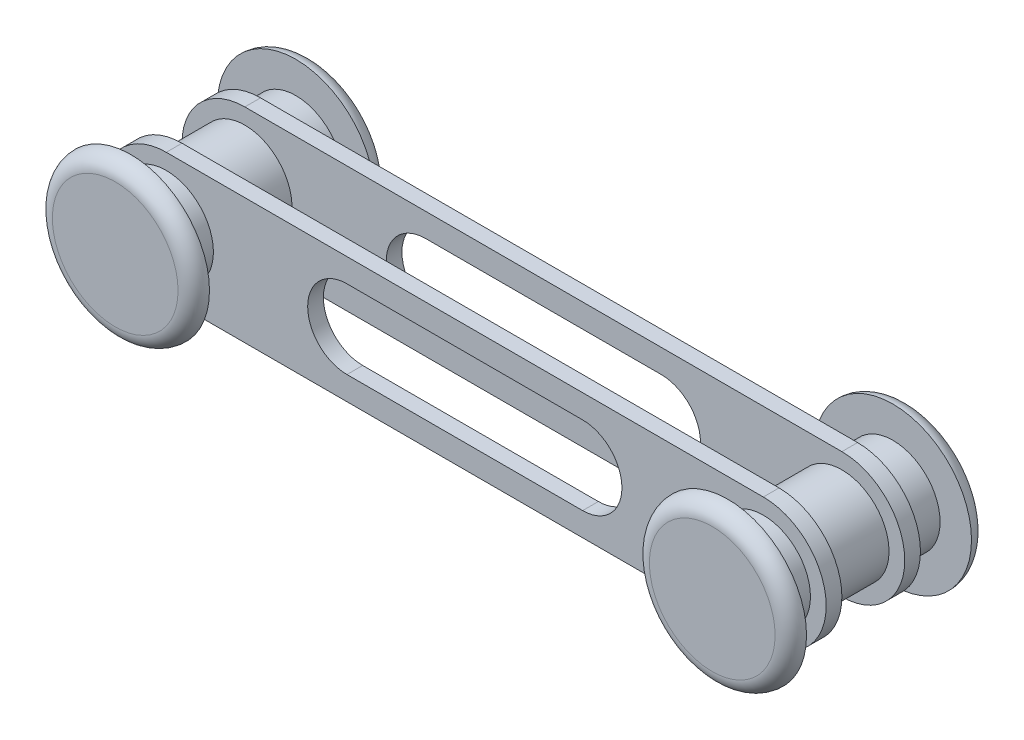
ISO-10303-21;
HEADER;
FILE_DESCRIPTION(('STEP AP214'),'2;1');
FILE_NAME('part.step','',(''),(''),'','','');
FILE_SCHEMA(('AUTOMOTIVE_DESIGN { 1 0 10303 214 1 1 1 1 }'));
ENDSEC;
DATA;
#1=APPLICATION_CONTEXT('core data for automotive mechanical design processes');
#2=APPLICATION_PROTOCOL_DEFINITION('international standard','automotive_design',2000,#1);
#3=PRODUCT_CONTEXT('',#1,'mechanical');
#4=PRODUCT('Part','Part','',(#3));
#5=PRODUCT_RELATED_PRODUCT_CATEGORY('part','',(#4));
#6=PRODUCT_DEFINITION_FORMATION('','',#4);
#7=PRODUCT_DEFINITION_CONTEXT('part definition',#1,'design');
#8=PRODUCT_DEFINITION('design','',#6,#7);
#9=PRODUCT_DEFINITION_SHAPE('','',#8);
#10=(LENGTH_UNIT() NAMED_UNIT(*) SI_UNIT(.MILLI.,.METRE.));
#11=(NAMED_UNIT(*) PLANE_ANGLE_UNIT() SI_UNIT($,.RADIAN.));
#12=(NAMED_UNIT(*) SI_UNIT($,.STERADIAN.) SOLID_ANGLE_UNIT());
#13=UNCERTAINTY_MEASURE_WITH_UNIT(LENGTH_MEASURE(1.E-05),#10,'distance_accuracy_value','');
#14=(GEOMETRIC_REPRESENTATION_CONTEXT(3) GLOBAL_UNCERTAINTY_ASSIGNED_CONTEXT((#13)) GLOBAL_UNIT_ASSIGNED_CONTEXT((#10,
#11,#12)) REPRESENTATION_CONTEXT('',''));
#15=CARTESIAN_POINT('',(0.,0.,0.));
#16=DIRECTION('',(0.,0.,1.));
#17=DIRECTION('',(1.,0.,0.));
#18=AXIS2_PLACEMENT_3D('',#15,#16,#17);
#19=CARTESIAN_POINT('',(380.,0.,-20.));
#20=DIRECTION('',(0.,0.,-1.));
#21=DIRECTION('',(1.,0.,0.));
#22=AXIS2_PLACEMENT_3D('',#19,#20,#21);
#23=PLANE('',#22);
#24=CARTESIAN_POINT('',(380.,0.,-20.));
#25=DIRECTION('',(0.,0.,1.));
#26=DIRECTION('',(1.,0.,0.));
#27=AXIS2_PLACEMENT_3D('',#24,#25,#26);
#28=CIRCLE('',#27,40.);
#29=CARTESIAN_POINT('',(380.,-40.,-20.));
#30=VERTEX_POINT('',#29);
#31=CARTESIAN_POINT('',(380.,40.,-20.));
#32=VERTEX_POINT('',#31);
#33=EDGE_CURVE('E201',#30,#32,#28,.T.);
#34=ORIENTED_EDGE('',*,*,#33,.T.);
#35=DIRECTION('',(-1.,0.,0.));
#36=VECTOR('',#35,1.);
#37=CARTESIAN_POINT('',(0.,40.,-20.));
#38=LINE('',#37,#36);
#39=CARTESIAN_POINT('',(0.,40.,-20.));
#40=VERTEX_POINT('',#39);
#41=EDGE_CURVE('E212',#32,#40,#38,.T.);
#42=ORIENTED_EDGE('',*,*,#41,.T.);
#43=CARTESIAN_POINT('',(0.,0.,-20.));
#44=DIRECTION('',(0.,0.,1.));
#45=DIRECTION('',(1.,0.,0.));
#46=AXIS2_PLACEMENT_3D('',#43,#44,#45);
#47=CIRCLE('',#46,40.);
#48=CARTESIAN_POINT('',(0.,-40.,-20.));
#49=VERTEX_POINT('',#48);
#50=EDGE_CURVE('E209',#40,#49,#47,.T.);
#51=ORIENTED_EDGE('',*,*,#50,.T.);
#52=DIRECTION('',(1.,0.,0.));
#53=VECTOR('',#52,1.);
#54=CARTESIAN_POINT('',(0.,-40.,-20.));
#55=LINE('',#54,#53);
#56=EDGE_CURVE('E205',#49,#30,#55,.T.);
#57=ORIENTED_EDGE('',*,*,#56,.T.);
#58=EDGE_LOOP('',(#34,#42,#51,#57));
#59=FACE_BOUND('',#58,.T.);
#60=CARTESIAN_POINT('',(380.,0.,-20.));
#61=DIRECTION('',(0.,0.,-1.));
#62=DIRECTION('',(-1.,0.,0.));
#63=AXIS2_PLACEMENT_3D('',#60,#61,#62);
#64=CIRCLE('',#63,30.);
#65=CARTESIAN_POINT('',(350.,0.,-20.));
#66=VERTEX_POINT('',#65);
#67=EDGE_CURVE('E253',#66,#66,#64,.T.);
#68=ORIENTED_EDGE('',*,*,#67,.T.);
#69=EDGE_LOOP('',(#68));
#70=FACE_BOUND('',#69,.T.);
#71=CARTESIAN_POINT('',(0.,0.,-20.));
#72=DIRECTION('',(0.,0.,-1.));
#73=DIRECTION('',(-1.,0.,0.));
#74=AXIS2_PLACEMENT_3D('',#71,#72,#73);
#75=CIRCLE('',#74,30.);
#76=CARTESIAN_POINT('',(-30.,0.,-20.));
#77=VERTEX_POINT('',#76);
#78=EDGE_CURVE('E248',#77,#77,#75,.T.);
#79=ORIENTED_EDGE('',*,*,#78,.T.);
#80=EDGE_LOOP('',(#79));
#81=FACE_BOUND('',#80,.T.);
#82=CARTESIAN_POINT('',(265.,0.,-20.));
#83=DIRECTION('',(0.,0.,-1.));
#84=DIRECTION('',(-1.,0.,0.));
#85=AXIS2_PLACEMENT_3D('',#82,#83,#84);
#86=CIRCLE('',#85,25.);
#87=CARTESIAN_POINT('',(265.,25.,-20.));
#88=VERTEX_POINT('',#87);
#89=CARTESIAN_POINT('',(265.,-25.,-20.));
#90=VERTEX_POINT('',#89);
#91=EDGE_CURVE('E168',#88,#90,#86,.T.);
#92=ORIENTED_EDGE('',*,*,#91,.T.);
#93=DIRECTION('',(-1.,0.,0.));
#94=VECTOR('',#93,1.);
#95=CARTESIAN_POINT('',(265.,-25.,-20.));
#96=LINE('',#95,#94);
#97=CARTESIAN_POINT('',(115.,-25.0000000000001,-20.));
#98=VERTEX_POINT('',#97);
#99=EDGE_CURVE('E156',#90,#98,#96,.T.);
#100=ORIENTED_EDGE('',*,*,#99,.T.);
#101=CARTESIAN_POINT('',(115.,0.,-20.));
#102=DIRECTION('',(0.,0.,-1.));
#103=DIRECTION('',(-1.,0.,0.));
#104=AXIS2_PLACEMENT_3D('',#101,#102,#103);
#105=CIRCLE('',#104,25.);
#106=CARTESIAN_POINT('',(115.,25.,-20.));
#107=VERTEX_POINT('',#106);
#108=EDGE_CURVE('E181',#98,#107,#105,.T.);
#109=ORIENTED_EDGE('',*,*,#108,.T.);
#110=DIRECTION('',(1.,0.,0.));
#111=VECTOR('',#110,1.);
#112=CARTESIAN_POINT('',(265.,25.,-20.));
#113=LINE('',#112,#111);
#114=EDGE_CURVE('E174',#107,#88,#113,.T.);
#115=ORIENTED_EDGE('',*,*,#114,.T.);
#116=EDGE_LOOP('',(#92,#100,#109,#115));
#117=FACE_BOUND('',#116,.T.);
#118=ADVANCED_FACE('F43',(#59,#70,#81,#117),#23,.F.);
#119=CARTESIAN_POINT('',(380.,0.,-30.));
#120=DIRECTION('',(0.,0.,-1.));
#121=DIRECTION('',(1.,0.,0.));
#122=AXIS2_PLACEMENT_3D('',#119,#120,#121);
#123=PLANE('',#122);
#124=CARTESIAN_POINT('',(0.,0.,-30.));
#125=DIRECTION('',(0.,0.,-1.));
#126=DIRECTION('',(-1.,0.,0.));
#127=AXIS2_PLACEMENT_3D('',#124,#125,#126);
#128=CIRCLE('',#127,30.);
#129=CARTESIAN_POINT('',(-30.,0.,-30.));
#130=VERTEX_POINT('',#129);
#131=EDGE_CURVE('E243',#130,#130,#128,.T.);
#132=ORIENTED_EDGE('',*,*,#131,.F.);
#133=EDGE_LOOP('',(#132));
#134=FACE_BOUND('',#133,.T.);
#135=CARTESIAN_POINT('',(380.,0.,-30.));
#136=DIRECTION('',(0.,0.,-1.));
#137=DIRECTION('',(-1.,0.,0.));
#138=AXIS2_PLACEMENT_3D('',#135,#136,#137);
#139=CIRCLE('',#138,30.);
#140=CARTESIAN_POINT('',(350.,0.,-30.));
#141=VERTEX_POINT('',#140);
#142=EDGE_CURVE('E231',#141,#141,#139,.T.);
#143=ORIENTED_EDGE('',*,*,#142,.F.);
#144=EDGE_LOOP('',(#143));
#145=FACE_BOUND('',#144,.T.);
#146=CARTESIAN_POINT('',(380.,0.,-30.));
#147=DIRECTION('',(0.,0.,1.));
#148=DIRECTION('',(1.,0.,0.));
#149=AXIS2_PLACEMENT_3D('',#146,#147,#148);
#150=CIRCLE('',#149,40.);
#151=CARTESIAN_POINT('',(380.,-40.,-30.));
#152=VERTEX_POINT('',#151);
#153=CARTESIAN_POINT('',(380.,40.,-30.));
#154=VERTEX_POINT('',#153);
#155=EDGE_CURVE('E164',#152,#154,#150,.T.);
#156=ORIENTED_EDGE('',*,*,#155,.F.);
#157=DIRECTION('',(1.,0.,0.));
#158=VECTOR('',#157,1.);
#159=CARTESIAN_POINT('',(0.,-40.,-30.));
#160=LINE('',#159,#158);
#161=CARTESIAN_POINT('',(0.,-40.,-30.));
#162=VERTEX_POINT('',#161);
#163=EDGE_CURVE('E219',#162,#152,#160,.T.);
#164=ORIENTED_EDGE('',*,*,#163,.F.);
#165=CARTESIAN_POINT('',(0.,0.,-30.));
#166=DIRECTION('',(0.,0.,1.));
#167=DIRECTION('',(1.,0.,0.));
#168=AXIS2_PLACEMENT_3D('',#165,#166,#167);
#169=CIRCLE('',#168,40.);
#170=CARTESIAN_POINT('',(0.,40.,-30.));
#171=VERTEX_POINT('',#170);
#172=EDGE_CURVE('E222',#171,#162,#169,.T.);
#173=ORIENTED_EDGE('',*,*,#172,.F.);
#174=DIRECTION('',(-1.,0.,0.));
#175=VECTOR('',#174,1.);
#176=CARTESIAN_POINT('',(0.,40.,-30.));
#177=LINE('',#176,#175);
#178=EDGE_CURVE('E206',#154,#171,#177,.T.);
#179=ORIENTED_EDGE('',*,*,#178,.F.);
#180=EDGE_LOOP('',(#156,#164,#173,#179));
#181=FACE_BOUND('',#180,.T.);
#182=DIRECTION('',(1.,0.,0.));
#183=VECTOR('',#182,1.);
#184=CARTESIAN_POINT('',(265.,-25.,-30.));
#185=LINE('',#184,#183);
#186=CARTESIAN_POINT('',(115.,-25.0000000000001,-30.));
#187=VERTEX_POINT('',#186);
#188=CARTESIAN_POINT('',(265.,-25.,-30.));
#189=VERTEX_POINT('',#188);
#190=EDGE_CURVE('E179',#187,#189,#185,.T.);
#191=ORIENTED_EDGE('',*,*,#190,.T.);
#192=CARTESIAN_POINT('',(265.,0.,-30.));
#193=DIRECTION('',(0.,0.,1.));
#194=DIRECTION('',(1.,0.,0.));
#195=AXIS2_PLACEMENT_3D('',#192,#193,#194);
#196=CIRCLE('',#195,25.);
#197=CARTESIAN_POINT('',(265.,25.,-30.));
#198=VERTEX_POINT('',#197);
#199=EDGE_CURVE('E67',#189,#198,#196,.T.);
#200=ORIENTED_EDGE('',*,*,#199,.T.);
#201=DIRECTION('',(-1.,0.,0.));
#202=VECTOR('',#201,1.);
#203=CARTESIAN_POINT('',(265.,25.,-30.));
#204=LINE('',#203,#202);
#205=CARTESIAN_POINT('',(115.,25.,-30.));
#206=VERTEX_POINT('',#205);
#207=EDGE_CURVE('E171',#198,#206,#204,.T.);
#208=ORIENTED_EDGE('',*,*,#207,.T.);
#209=CARTESIAN_POINT('',(115.,0.,-30.));
#210=DIRECTION('',(0.,0.,1.));
#211=DIRECTION('',(1.,0.,0.));
#212=AXIS2_PLACEMENT_3D('',#209,#210,#211);
#213=CIRCLE('',#212,25.);
#214=EDGE_CURVE('E187',#206,#187,#213,.T.);
#215=ORIENTED_EDGE('',*,*,#214,.T.);
#216=EDGE_LOOP('',(#191,#200,#208,#215));
#217=FACE_BOUND('',#216,.T.);
#218=ADVANCED_FACE('F421',(#134,#145,#181,#217),#123,.T.);
#219=CARTESIAN_POINT('',(0.,0.,52.5));
#220=DIRECTION('',(0.,0.,-1.));
#221=DIRECTION('',(-1.,0.,0.));
#222=AXIS2_PLACEMENT_3D('',#219,#220,#221);
#223=CYLINDRICAL_SURFACE('',#222,30.);
#224=CARTESIAN_POINT('',(0.,0.,20.));
#225=DIRECTION('',(0.,0.,1.));
#226=DIRECTION('',(1.,0.,0.));
#227=AXIS2_PLACEMENT_3D('',#224,#225,#226);
#228=CIRCLE('',#227,30.);
#229=CARTESIAN_POINT('',(30.,0.,20.));
#230=VERTEX_POINT('',#229);
#231=EDGE_CURVE('E268',#230,#230,#228,.T.);
#232=ORIENTED_EDGE('',*,*,#231,.F.);
#233=EDGE_LOOP('',(#232));
#234=FACE_BOUND('',#233,.T.);
#235=ORIENTED_EDGE('',*,*,#78,.F.);
#236=EDGE_LOOP('',(#235));
#237=FACE_BOUND('',#236,.T.);
#238=ADVANCED_FACE('F423',(#234,#237),#223,.T.);
#239=CARTESIAN_POINT('',(380.,0.,52.5));
#240=DIRECTION('',(0.,0.,-1.));
#241=DIRECTION('',(-1.,0.,0.));
#242=AXIS2_PLACEMENT_3D('',#239,#240,#241);
#243=CYLINDRICAL_SURFACE('',#242,30.);
#244=CARTESIAN_POINT('',(380.,0.,20.));
#245=DIRECTION('',(0.,0.,1.));
#246=DIRECTION('',(1.,0.,0.));
#247=AXIS2_PLACEMENT_3D('',#244,#245,#246);
#248=CIRCLE('',#247,30.);
#249=CARTESIAN_POINT('',(410.,0.,20.));
#250=VERTEX_POINT('',#249);
#251=EDGE_CURVE('E264',#250,#250,#248,.F.);
#252=ORIENTED_EDGE('',*,*,#251,.T.);
#253=EDGE_LOOP('',(#252));
#254=FACE_BOUND('',#253,.T.);
#255=ORIENTED_EDGE('',*,*,#67,.F.);
#256=EDGE_LOOP('',(#255));
#257=FACE_BOUND('',#256,.T.);
#258=ADVANCED_FACE('F430',(#254,#257),#243,.T.);
#259=CARTESIAN_POINT('',(380.,0.,20.));
#260=DIRECTION('',(0.,0.,1.));
#261=DIRECTION('',(1.,0.,0.));
#262=AXIS2_PLACEMENT_3D('',#259,#260,#261);
#263=CYLINDRICAL_SURFACE('',#262,40.);
#264=CARTESIAN_POINT('',(380.,0.,30.));
#265=DIRECTION('',(0.,0.,1.));
#266=DIRECTION('',(1.,0.,0.));
#267=AXIS2_PLACEMENT_3D('',#264,#265,#266);
#268=CIRCLE('',#267,40.);
#269=CARTESIAN_POINT('',(380.,-40.,30.));
#270=VERTEX_POINT('',#269);
#271=CARTESIAN_POINT('',(380.,40.,30.));
#272=VERTEX_POINT('',#271);
#273=EDGE_CURVE('E312',#270,#272,#268,.T.);
#274=ORIENTED_EDGE('',*,*,#273,.F.);
#275=DIRECTION('',(0.,0.,1.));
#276=VECTOR('',#275,1.);
#277=CARTESIAN_POINT('',(380.,-40.,20.));
#278=LINE('',#277,#276);
#279=CARTESIAN_POINT('',(380.,-40.,20.));
#280=VERTEX_POINT('',#279);
#281=EDGE_CURVE('E345',#280,#270,#278,.T.);
#282=ORIENTED_EDGE('',*,*,#281,.F.);
#283=CARTESIAN_POINT('',(380.,0.,20.));
#284=DIRECTION('',(0.,0.,1.));
#285=DIRECTION('',(1.,0.,0.));
#286=AXIS2_PLACEMENT_3D('',#283,#284,#285);
#287=CIRCLE('',#286,40.);
#288=CARTESIAN_POINT('',(380.,40.,20.));
#289=VERTEX_POINT('',#288);
#290=EDGE_CURVE('E313',#280,#289,#287,.T.);
#291=ORIENTED_EDGE('',*,*,#290,.T.);
#292=DIRECTION('',(0.,0.,1.));
#293=VECTOR('',#292,1.);
#294=CARTESIAN_POINT('',(380.,40.,20.));
#295=LINE('',#294,#293);
#296=EDGE_CURVE('E330',#289,#272,#295,.T.);
#297=ORIENTED_EDGE('',*,*,#296,.T.);
#298=EDGE_LOOP('',(#274,#282,#291,#297));
#299=FACE_BOUND('',#298,.T.);
#300=ADVANCED_FACE('F491',(#299),#263,.T.);
#301=CARTESIAN_POINT('',(0.,-40.,20.));
#302=DIRECTION('',(0.,-1.,0.));
#303=DIRECTION('',(1.,0.,0.));
#304=AXIS2_PLACEMENT_3D('',#301,#302,#303);
#305=PLANE('',#304);
#306=DIRECTION('',(1.,0.,0.));
#307=VECTOR('',#306,1.);
#308=CARTESIAN_POINT('',(0.,-40.,30.));
#309=LINE('',#308,#307);
#310=CARTESIAN_POINT('',(0.,-40.,30.));
#311=VERTEX_POINT('',#310);
#312=EDGE_CURVE('E318',#311,#270,#309,.T.);
#313=ORIENTED_EDGE('',*,*,#312,.F.);
#314=DIRECTION('',(0.,0.,1.));
#315=VECTOR('',#314,1.);
#316=CARTESIAN_POINT('',(0.,-40.,20.));
#317=LINE('',#316,#315);
#318=CARTESIAN_POINT('',(0.,-40.,20.));
#319=VERTEX_POINT('',#318);
#320=EDGE_CURVE('E349',#319,#311,#317,.T.);
#321=ORIENTED_EDGE('',*,*,#320,.F.);
#322=DIRECTION('',(1.,0.,0.));
#323=VECTOR('',#322,1.);
#324=CARTESIAN_POINT('',(0.,-40.,20.));
#325=LINE('',#324,#323);
#326=EDGE_CURVE('E326',#319,#280,#325,.T.);
#327=ORIENTED_EDGE('',*,*,#326,.T.);
#328=ORIENTED_EDGE('',*,*,#281,.T.);
#329=EDGE_LOOP('',(#313,#321,#327,#328));
#330=FACE_BOUND('',#329,.T.);
#331=ADVANCED_FACE('F487',(#330),#305,.T.);
#332=CARTESIAN_POINT('',(0.,0.,20.));
#333=DIRECTION('',(0.,0.,1.));
#334=DIRECTION('',(1.,0.,0.));
#335=AXIS2_PLACEMENT_3D('',#332,#333,#334);
#336=CYLINDRICAL_SURFACE('',#335,40.);
#337=CARTESIAN_POINT('',(0.,0.,30.));
#338=DIRECTION('',(0.,0.,1.));
#339=DIRECTION('',(1.,0.,0.));
#340=AXIS2_PLACEMENT_3D('',#337,#338,#339);
#341=CIRCLE('',#340,40.);
#342=CARTESIAN_POINT('',(0.,40.,30.));
#343=VERTEX_POINT('',#342);
#344=EDGE_CURVE('E338',#343,#311,#341,.T.);
#345=ORIENTED_EDGE('',*,*,#344,.F.);
#346=DIRECTION('',(0.,0.,1.));
#347=VECTOR('',#346,1.);
#348=CARTESIAN_POINT('',(0.,40.,20.));
#349=LINE('',#348,#347);
#350=CARTESIAN_POINT('',(0.,40.,20.));
#351=VERTEX_POINT('',#350);
#352=EDGE_CURVE('E352',#351,#343,#349,.T.);
#353=ORIENTED_EDGE('',*,*,#352,.F.);
#354=CARTESIAN_POINT('',(0.,0.,20.));
#355=DIRECTION('',(0.,0.,1.));
#356=DIRECTION('',(1.,0.,0.));
#357=AXIS2_PLACEMENT_3D('',#354,#355,#356);
#358=CIRCLE('',#357,40.);
#359=EDGE_CURVE('E322',#351,#319,#358,.T.);
#360=ORIENTED_EDGE('',*,*,#359,.T.);
#361=ORIENTED_EDGE('',*,*,#320,.T.);
#362=EDGE_LOOP('',(#345,#353,#360,#361));
#363=FACE_BOUND('',#362,.T.);
#364=ADVANCED_FACE('F490',(#363),#336,.T.);
#365=CARTESIAN_POINT('',(0.,40.,20.));
#366=DIRECTION('',(0.,1.,0.));
#367=DIRECTION('',(0.,0.,1.));
#368=AXIS2_PLACEMENT_3D('',#365,#366,#367);
#369=PLANE('',#368);
#370=DIRECTION('',(-1.,0.,0.));
#371=VECTOR('',#370,1.);
#372=CARTESIAN_POINT('',(0.,40.,30.));
#373=LINE('',#372,#371);
#374=EDGE_CURVE('E334',#272,#343,#373,.T.);
#375=ORIENTED_EDGE('',*,*,#374,.F.);
#376=ORIENTED_EDGE('',*,*,#296,.F.);
#377=DIRECTION('',(-1.,0.,0.));
#378=VECTOR('',#377,1.);
#379=CARTESIAN_POINT('',(0.,40.,20.));
#380=LINE('',#379,#378);
#381=EDGE_CURVE('E317',#289,#351,#380,.T.);
#382=ORIENTED_EDGE('',*,*,#381,.T.);
#383=ORIENTED_EDGE('',*,*,#352,.T.);
#384=EDGE_LOOP('',(#375,#376,#382,#383));
#385=FACE_BOUND('',#384,.T.);
#386=ADVANCED_FACE('F482',(#385),#369,.T.);
#387=CARTESIAN_POINT('',(380.,0.,20.));
#388=DIRECTION('',(0.,0.,1.));
#389=DIRECTION('',(1.,0.,0.));
#390=AXIS2_PLACEMENT_3D('',#387,#388,#389);
#391=PLANE('',#390);
#392=ORIENTED_EDGE('',*,*,#251,.F.);
#393=EDGE_LOOP('',(#392));
#394=FACE_BOUND('',#393,.T.);
#395=DIRECTION('',(-1.,0.,0.));
#396=VECTOR('',#395,1.);
#397=CARTESIAN_POINT('',(265.,-25.,20.));
#398=LINE('',#397,#396);
#399=CARTESIAN_POINT('',(265.,-25.,20.));
#400=VERTEX_POINT('',#399);
#401=CARTESIAN_POINT('',(115.,-25.0000000000001,20.));
#402=VERTEX_POINT('',#401);
#403=EDGE_CURVE('E272',#400,#402,#398,.T.);
#404=ORIENTED_EDGE('',*,*,#403,.F.);
#405=CARTESIAN_POINT('',(265.,0.,20.));
#406=DIRECTION('',(0.,0.,1.));
#407=DIRECTION('',(1.,0.,0.));
#408=AXIS2_PLACEMENT_3D('',#405,#406,#407);
#409=CIRCLE('',#408,25.);
#410=CARTESIAN_POINT('',(265.,25.,20.));
#411=VERTEX_POINT('',#410);
#412=EDGE_CURVE('E276',#411,#400,#409,.F.);
#413=ORIENTED_EDGE('',*,*,#412,.F.);
#414=DIRECTION('',(1.,0.,0.));
#415=VECTOR('',#414,1.);
#416=CARTESIAN_POINT('',(265.,25.,20.));
#417=LINE('',#416,#415);
#418=CARTESIAN_POINT('',(115.,25.,20.));
#419=VERTEX_POINT('',#418);
#420=EDGE_CURVE('E299',#419,#411,#417,.T.);
#421=ORIENTED_EDGE('',*,*,#420,.F.);
#422=CARTESIAN_POINT('',(115.,0.,20.));
#423=DIRECTION('',(0.,0.,1.));
#424=DIRECTION('',(1.,0.,0.));
#425=AXIS2_PLACEMENT_3D('',#422,#423,#424);
#426=CIRCLE('',#425,25.);
#427=EDGE_CURVE('E269',#402,#419,#426,.F.);
#428=ORIENTED_EDGE('',*,*,#427,.F.);
#429=EDGE_LOOP('',(#404,#413,#421,#428));
#430=FACE_BOUND('',#429,.T.);
#431=ORIENTED_EDGE('',*,*,#231,.T.);
#432=EDGE_LOOP('',(#431));
#433=FACE_BOUND('',#432,.T.);
#434=ORIENTED_EDGE('',*,*,#290,.F.);
#435=ORIENTED_EDGE('',*,*,#326,.F.);
#436=ORIENTED_EDGE('',*,*,#359,.F.);
#437=ORIENTED_EDGE('',*,*,#381,.F.);
#438=EDGE_LOOP('',(#434,#435,#436,#437));
#439=FACE_BOUND('',#438,.T.);
#440=ADVANCED_FACE('F478',(#394,#430,#433,#439),#391,.F.);
#441=CARTESIAN_POINT('',(380.,0.,30.));
#442=DIRECTION('',(0.,0.,1.));
#443=DIRECTION('',(1.,0.,0.));
#444=AXIS2_PLACEMENT_3D('',#441,#442,#443);
#445=PLANE('',#444);
#446=CARTESIAN_POINT('',(380.,0.,30.));
#447=DIRECTION('',(0.,0.,1.));
#448=DIRECTION('',(1.,0.,0.));
#449=AXIS2_PLACEMENT_3D('',#446,#447,#448);
#450=CIRCLE('',#449,30.);
#451=CARTESIAN_POINT('',(410.,0.,30.));
#452=VERTEX_POINT('',#451);
#453=EDGE_CURVE('E257',#452,#452,#450,.F.);
#454=ORIENTED_EDGE('',*,*,#453,.T.);
#455=EDGE_LOOP('',(#454));
#456=FACE_BOUND('',#455,.T.);
#457=CARTESIAN_POINT('',(265.,0.,30.));
#458=DIRECTION('',(0.,0.,1.));
#459=DIRECTION('',(1.,0.,0.));
#460=AXIS2_PLACEMENT_3D('',#457,#458,#459);
#461=CIRCLE('',#460,25.);
#462=CARTESIAN_POINT('',(265.,-25.,30.));
#463=VERTEX_POINT('',#462);
#464=CARTESIAN_POINT('',(265.,25.,30.));
#465=VERTEX_POINT('',#464);
#466=EDGE_CURVE('E280',#463,#465,#461,.T.);
#467=ORIENTED_EDGE('',*,*,#466,.F.);
#468=DIRECTION('',(1.,0.,0.));
#469=VECTOR('',#468,1.);
#470=CARTESIAN_POINT('',(265.,-25.,30.));
#471=LINE('',#470,#469);
#472=CARTESIAN_POINT('',(115.,-25.0000000000001,30.));
#473=VERTEX_POINT('',#472);
#474=EDGE_CURVE('E291',#473,#463,#471,.T.);
#475=ORIENTED_EDGE('',*,*,#474,.F.);
#476=CARTESIAN_POINT('',(115.,0.,30.));
#477=DIRECTION('',(0.,0.,1.));
#478=DIRECTION('',(1.,0.,0.));
#479=AXIS2_PLACEMENT_3D('',#476,#477,#478);
#480=CIRCLE('',#479,25.);
#481=CARTESIAN_POINT('',(115.,25.,30.));
#482=VERTEX_POINT('',#481);
#483=EDGE_CURVE('E287',#482,#473,#480,.T.);
#484=ORIENTED_EDGE('',*,*,#483,.F.);
#485=DIRECTION('',(-1.,0.,0.));
#486=VECTOR('',#485,1.);
#487=CARTESIAN_POINT('',(265.,25.,30.));
#488=LINE('',#487,#486);
#489=EDGE_CURVE('E283',#465,#482,#488,.T.);
#490=ORIENTED_EDGE('',*,*,#489,.F.);
#491=EDGE_LOOP('',(#467,#475,#484,#490));
#492=FACE_BOUND('',#491,.T.);
#493=CARTESIAN_POINT('',(0.,0.,30.));
#494=DIRECTION('',(0.,0.,1.));
#495=DIRECTION('',(1.,0.,0.));
#496=AXIS2_PLACEMENT_3D('',#493,#494,#495);
#497=CIRCLE('',#496,30.);
#498=CARTESIAN_POINT('',(30.,0.,30.));
#499=VERTEX_POINT('',#498);
#500=EDGE_CURVE('E348',#499,#499,#497,.T.);
#501=ORIENTED_EDGE('',*,*,#500,.F.);
#502=EDGE_LOOP('',(#501));
#503=FACE_BOUND('',#502,.T.);
#504=ORIENTED_EDGE('',*,*,#273,.T.);
#505=ORIENTED_EDGE('',*,*,#374,.T.);
#506=ORIENTED_EDGE('',*,*,#344,.T.);
#507=ORIENTED_EDGE('',*,*,#312,.T.);
#508=EDGE_LOOP('',(#504,#505,#506,#507));
#509=FACE_BOUND('',#508,.T.);
#510=ADVANCED_FACE('F481',(#456,#492,#503,#509),#445,.T.);
#511=ORIENTED_EDGE('',*,*,#500,.T.);
#512=EDGE_LOOP('',(#511));
#513=FACE_BOUND('',#512,.T.);
#514=CARTESIAN_POINT('',(0.,0.,52.5));
#515=DIRECTION('',(0.,0.,1.));
#516=DIRECTION('',(1.,0.,0.));
#517=AXIS2_PLACEMENT_3D('',#514,#515,#516);
#518=CIRCLE('',#517,30.);
#519=CARTESIAN_POINT('',(30.,0.,52.5));
#520=VERTEX_POINT('',#519);
#521=EDGE_CURVE('E357',#520,#520,#518,.T.);
#522=ORIENTED_EDGE('',*,*,#521,.F.);
#523=EDGE_LOOP('',(#522));
#524=FACE_BOUND('',#523,.T.);
#525=ADVANCED_FACE('F434',(#513,#524),#223,.T.);
#526=CARTESIAN_POINT('',(265.,0.,-52.501));
#527=DIRECTION('',(0.,0.,1.));
#528=DIRECTION('',(1.,0.,0.));
#529=AXIS2_PLACEMENT_3D('',#526,#527,#528);
#530=CYLINDRICAL_SURFACE('',#529,25.);
#531=ORIENTED_EDGE('',*,*,#412,.T.);
#532=DIRECTION('',(0.,0.,1.));
#533=VECTOR('',#532,1.);
#534=CARTESIAN_POINT('',(265.,-25.,-52.501));
#535=LINE('',#534,#533);
#536=EDGE_CURVE('E296',#400,#463,#535,.T.);
#537=ORIENTED_EDGE('',*,*,#536,.T.);
#538=ORIENTED_EDGE('',*,*,#466,.T.);
#539=DIRECTION('',(0.,0.,1.));
#540=VECTOR('',#539,1.);
#541=CARTESIAN_POINT('',(265.,25.,-52.501));
#542=LINE('',#541,#540);
#543=EDGE_CURVE('E295',#411,#465,#542,.T.);
#544=ORIENTED_EDGE('',*,*,#543,.F.);
#545=EDGE_LOOP('',(#531,#537,#538,#544));
#546=FACE_BOUND('',#545,.T.);
#547=ADVANCED_FACE('F467',(#546),#530,.F.);
#548=CARTESIAN_POINT('',(265.,-25.,-52.501));
#549=DIRECTION('',(0.,-1.,0.));
#550=DIRECTION('',(1.,0.,0.));
#551=AXIS2_PLACEMENT_3D('',#548,#549,#550);
#552=PLANE('',#551);
#553=ORIENTED_EDGE('',*,*,#403,.T.);
#554=DIRECTION('',(0.,0.,1.));
#555=VECTOR('',#554,1.);
#556=CARTESIAN_POINT('',(115.,-25.0000000000001,-52.501));
#557=LINE('',#556,#555);
#558=EDGE_CURVE('E300',#402,#473,#557,.T.);
#559=ORIENTED_EDGE('',*,*,#558,.T.);
#560=ORIENTED_EDGE('',*,*,#474,.T.);
#561=ORIENTED_EDGE('',*,*,#536,.F.);
#562=EDGE_LOOP('',(#553,#559,#560,#561));
#563=FACE_BOUND('',#562,.T.);
#564=ADVANCED_FACE('F463',(#563),#552,.F.);
#565=CARTESIAN_POINT('',(115.,0.,-52.501));
#566=DIRECTION('',(0.,0.,1.));
#567=DIRECTION('',(1.,0.,0.));
#568=AXIS2_PLACEMENT_3D('',#565,#566,#567);
#569=CYLINDRICAL_SURFACE('',#568,25.);
#570=ORIENTED_EDGE('',*,*,#427,.T.);
#571=DIRECTION('',(0.,0.,1.));
#572=VECTOR('',#571,1.);
#573=CARTESIAN_POINT('',(115.,25.,-52.501));
#574=LINE('',#573,#572);
#575=EDGE_CURVE('E303',#419,#482,#574,.T.);
#576=ORIENTED_EDGE('',*,*,#575,.T.);
#577=ORIENTED_EDGE('',*,*,#483,.T.);
#578=ORIENTED_EDGE('',*,*,#558,.F.);
#579=EDGE_LOOP('',(#570,#576,#577,#578));
#580=FACE_BOUND('',#579,.T.);
#581=ADVANCED_FACE('F466',(#580),#569,.F.);
#582=CARTESIAN_POINT('',(265.,25.,-52.501));
#583=DIRECTION('',(0.,1.,0.));
#584=DIRECTION('',(-1.,0.,0.));
#585=AXIS2_PLACEMENT_3D('',#582,#583,#584);
#586=PLANE('',#585);
#587=ORIENTED_EDGE('',*,*,#420,.T.);
#588=ORIENTED_EDGE('',*,*,#543,.T.);
#589=ORIENTED_EDGE('',*,*,#489,.T.);
#590=ORIENTED_EDGE('',*,*,#575,.F.);
#591=EDGE_LOOP('',(#587,#588,#589,#590));
#592=FACE_BOUND('',#591,.T.);
#593=ADVANCED_FACE('F460',(#592),#586,.F.);
#594=ORIENTED_EDGE('',*,*,#453,.F.);
#595=EDGE_LOOP('',(#594));
#596=FACE_BOUND('',#595,.T.);
#597=CARTESIAN_POINT('',(380.,0.,52.5));
#598=DIRECTION('',(0.,0.,1.));
#599=DIRECTION('',(1.,0.,0.));
#600=AXIS2_PLACEMENT_3D('',#597,#598,#599);
#601=CIRCLE('',#600,30.);
#602=CARTESIAN_POINT('',(410.,0.,52.5));
#603=VERTEX_POINT('',#602);
#604=EDGE_CURVE('E247',#603,#603,#601,.T.);
#605=ORIENTED_EDGE('',*,*,#604,.F.);
#606=EDGE_LOOP('',(#605));
#607=FACE_BOUND('',#606,.T.);
#608=ADVANCED_FACE('F456',(#596,#607),#243,.T.);
#609=CARTESIAN_POINT('',(380.,0.,-20.));
#610=DIRECTION('',(0.,0.,-1.));
#611=DIRECTION('',(-1.,0.,0.));
#612=AXIS2_PLACEMENT_3D('',#609,#610,#611);
#613=CYLINDRICAL_SURFACE('',#612,40.);
#614=ORIENTED_EDGE('',*,*,#155,.T.);
#615=DIRECTION('',(0.,0.,-1.));
#616=VECTOR('',#615,1.);
#617=CARTESIAN_POINT('',(380.,40.,-20.));
#618=LINE('',#617,#616);
#619=EDGE_CURVE('E227',#32,#154,#618,.T.);
#620=ORIENTED_EDGE('',*,*,#619,.F.);
#621=ORIENTED_EDGE('',*,*,#33,.F.);
#622=DIRECTION('',(0.,0.,-1.));
#623=VECTOR('',#622,1.);
#624=CARTESIAN_POINT('',(380.,-40.,-20.));
#625=LINE('',#624,#623);
#626=EDGE_CURVE('E215',#30,#152,#625,.T.);
#627=ORIENTED_EDGE('',*,*,#626,.T.);
#628=EDGE_LOOP('',(#614,#620,#621,#627));
#629=FACE_BOUND('',#628,.T.);
#630=ADVANCED_FACE('F445',(#629),#613,.T.);
#631=CARTESIAN_POINT('',(0.,40.,-20.));
#632=DIRECTION('',(0.,-1.,0.));
#633=DIRECTION('',(0.,0.,-1.));
#634=AXIS2_PLACEMENT_3D('',#631,#632,#633);
#635=PLANE('',#634);
#636=ORIENTED_EDGE('',*,*,#178,.T.);
#637=DIRECTION('',(0.,0.,-1.));
#638=VECTOR('',#637,1.);
#639=CARTESIAN_POINT('',(0.,40.,-20.));
#640=LINE('',#639,#638);
#641=EDGE_CURVE('E232',#40,#171,#640,.T.);
#642=ORIENTED_EDGE('',*,*,#641,.F.);
#643=ORIENTED_EDGE('',*,*,#41,.F.);
#644=ORIENTED_EDGE('',*,*,#619,.T.);
#645=EDGE_LOOP('',(#636,#642,#643,#644));
#646=FACE_BOUND('',#645,.T.);
#647=ADVANCED_FACE('F441',(#646),#635,.F.);
#648=CARTESIAN_POINT('',(0.,0.,-20.));
#649=DIRECTION('',(0.,0.,-1.));
#650=DIRECTION('',(-1.,0.,0.));
#651=AXIS2_PLACEMENT_3D('',#648,#649,#650);
#652=CYLINDRICAL_SURFACE('',#651,40.);
#653=ORIENTED_EDGE('',*,*,#172,.T.);
#654=DIRECTION('',(0.,0.,-1.));
#655=VECTOR('',#654,1.);
#656=CARTESIAN_POINT('',(0.,-40.,-20.));
#657=LINE('',#656,#655);
#658=EDGE_CURVE('E236',#49,#162,#657,.T.);
#659=ORIENTED_EDGE('',*,*,#658,.F.);
#660=ORIENTED_EDGE('',*,*,#50,.F.);
#661=ORIENTED_EDGE('',*,*,#641,.T.);
#662=EDGE_LOOP('',(#653,#659,#660,#661));
#663=FACE_BOUND('',#662,.T.);
#664=ADVANCED_FACE('F444',(#663),#652,.T.);
#665=CARTESIAN_POINT('',(0.,-40.,-20.));
#666=DIRECTION('',(0.,1.,0.));
#667=DIRECTION('',(-1.,0.,0.));
#668=AXIS2_PLACEMENT_3D('',#665,#666,#667);
#669=PLANE('',#668);
#670=ORIENTED_EDGE('',*,*,#163,.T.);
#671=ORIENTED_EDGE('',*,*,#626,.F.);
#672=ORIENTED_EDGE('',*,*,#56,.F.);
#673=ORIENTED_EDGE('',*,*,#658,.T.);
#674=EDGE_LOOP('',(#670,#671,#672,#673));
#675=FACE_BOUND('',#674,.T.);
#676=ADVANCED_FACE('F449',(#675),#669,.F.);
#677=ORIENTED_EDGE('',*,*,#131,.T.);
#678=EDGE_LOOP('',(#677));
#679=FACE_BOUND('',#678,.T.);
#680=CARTESIAN_POINT('',(0.,0.,-52.5));
#681=DIRECTION('',(0.,0.,1.));
#682=DIRECTION('',(1.,0.,0.));
#683=AXIS2_PLACEMENT_3D('',#680,#681,#682);
#684=CIRCLE('',#683,30.);
#685=CARTESIAN_POINT('',(30.,0.,-52.5));
#686=VERTEX_POINT('',#685);
#687=EDGE_CURVE('E361',#686,#686,#684,.T.);
#688=ORIENTED_EDGE('',*,*,#687,.T.);
#689=EDGE_LOOP('',(#688));
#690=FACE_BOUND('',#689,.T.);
#691=ADVANCED_FACE('F433',(#679,#690),#223,.T.);
#692=ORIENTED_EDGE('',*,*,#142,.T.);
#693=EDGE_LOOP('',(#692));
#694=FACE_BOUND('',#693,.T.);
#695=CARTESIAN_POINT('',(380.,0.,-52.5));
#696=DIRECTION('',(0.,0.,1.));
#697=DIRECTION('',(1.,0.,0.));
#698=AXIS2_PLACEMENT_3D('',#695,#696,#697);
#699=CIRCLE('',#698,30.);
#700=CARTESIAN_POINT('',(410.,0.,-52.5));
#701=VERTEX_POINT('',#700);
#702=EDGE_CURVE('E258',#701,#701,#699,.T.);
#703=ORIENTED_EDGE('',*,*,#702,.T.);
#704=EDGE_LOOP('',(#703));
#705=FACE_BOUND('',#704,.T.);
#706=ADVANCED_FACE('F462',(#694,#705),#243,.T.);
#707=CARTESIAN_POINT('',(265.,0.,52.501));
#708=DIRECTION('',(0.,0.,-1.));
#709=DIRECTION('',(-1.,0.,0.));
#710=AXIS2_PLACEMENT_3D('',#707,#708,#709);
#711=CYLINDRICAL_SURFACE('',#710,25.);
#712=DIRECTION('',(0.,0.,-1.));
#713=VECTOR('',#712,1.);
#714=CARTESIAN_POINT('',(265.,25.,52.501));
#715=LINE('',#714,#713);
#716=EDGE_CURVE('E165',#88,#198,#715,.T.);
#717=ORIENTED_EDGE('',*,*,#716,.T.);
#718=ORIENTED_EDGE('',*,*,#199,.F.);
#719=DIRECTION('',(0.,0.,-1.));
#720=VECTOR('',#719,1.);
#721=CARTESIAN_POINT('',(265.,-25.,52.501));
#722=LINE('',#721,#720);
#723=EDGE_CURVE('E158',#90,#189,#722,.T.);
#724=ORIENTED_EDGE('',*,*,#723,.F.);
#725=ORIENTED_EDGE('',*,*,#91,.F.);
#726=EDGE_LOOP('',(#717,#718,#724,#725));
#727=FACE_BOUND('',#726,.T.);
#728=ADVANCED_FACE('F167',(#727),#711,.F.);
#729=CARTESIAN_POINT('',(265.,25.,52.501));
#730=DIRECTION('',(0.,-1.,0.));
#731=DIRECTION('',(1.,0.,0.));
#732=AXIS2_PLACEMENT_3D('',#729,#730,#731);
#733=PLANE('',#732);
#734=DIRECTION('',(0.,0.,-1.));
#735=VECTOR('',#734,1.);
#736=CARTESIAN_POINT('',(115.,25.,52.501));
#737=LINE('',#736,#735);
#738=EDGE_CURVE('E196',#107,#206,#737,.T.);
#739=ORIENTED_EDGE('',*,*,#738,.T.);
#740=ORIENTED_EDGE('',*,*,#207,.F.);
#741=ORIENTED_EDGE('',*,*,#716,.F.);
#742=ORIENTED_EDGE('',*,*,#114,.F.);
#743=EDGE_LOOP('',(#739,#740,#741,#742));
#744=FACE_BOUND('',#743,.T.);
#745=ADVANCED_FACE('F419',(#744),#733,.T.);
#746=CARTESIAN_POINT('',(115.,0.,52.501));
#747=DIRECTION('',(0.,0.,-1.));
#748=DIRECTION('',(-1.,0.,0.));
#749=AXIS2_PLACEMENT_3D('',#746,#747,#748);
#750=CYLINDRICAL_SURFACE('',#749,25.);
#751=DIRECTION('',(0.,0.,-1.));
#752=VECTOR('',#751,1.);
#753=CARTESIAN_POINT('',(115.,-25.0000000000001,52.501));
#754=LINE('',#753,#752);
#755=EDGE_CURVE('E59',#98,#187,#754,.T.);
#756=ORIENTED_EDGE('',*,*,#755,.T.);
#757=ORIENTED_EDGE('',*,*,#214,.F.);
#758=ORIENTED_EDGE('',*,*,#738,.F.);
#759=ORIENTED_EDGE('',*,*,#108,.F.);
#760=EDGE_LOOP('',(#756,#757,#758,#759));
#761=FACE_BOUND('',#760,.T.);
#762=ADVANCED_FACE('F415',(#761),#750,.F.);
#763=CARTESIAN_POINT('',(265.,-25.,52.501));
#764=DIRECTION('',(0.,1.,0.));
#765=DIRECTION('',(-1.,0.,0.));
#766=AXIS2_PLACEMENT_3D('',#763,#764,#765);
#767=PLANE('',#766);
#768=ORIENTED_EDGE('',*,*,#723,.T.);
#769=ORIENTED_EDGE('',*,*,#190,.F.);
#770=ORIENTED_EDGE('',*,*,#755,.F.);
#771=ORIENTED_EDGE('',*,*,#99,.F.);
#772=EDGE_LOOP('',(#768,#769,#770,#771));
#773=FACE_BOUND('',#772,.T.);
#774=ADVANCED_FACE('F157',(#773),#767,.T.);
#775=CARTESIAN_POINT('',(0.,0.,62.5));
#776=DIRECTION('',(0.,0.,1.));
#777=DIRECTION('',(1.,0.,0.));
#778=AXIS2_PLACEMENT_3D('',#775,#776,#777);
#779=PLANE('',#778);
#780=CARTESIAN_POINT('',(0.,0.,62.5));
#781=DIRECTION('',(0.,0.,1.));
#782=DIRECTION('',(1.,0.,0.));
#783=AXIS2_PLACEMENT_3D('',#780,#781,#782);
#784=CIRCLE('',#783,40.);
#785=CARTESIAN_POINT('',(40.,0.,62.5));
#786=VERTEX_POINT('',#785);
#787=EDGE_CURVE('E384',#786,#786,#784,.T.);
#788=ORIENTED_EDGE('',*,*,#787,.T.);
#789=EDGE_LOOP('',(#788));
#790=FACE_BOUND('',#789,.T.);
#791=ADVANCED_FACE('F523',(#790),#779,.T.);
#792=CARTESIAN_POINT('',(0.,0.,52.5));
#793=DIRECTION('',(0.,0.,1.));
#794=DIRECTION('',(1.,0.,0.));
#795=AXIS2_PLACEMENT_3D('',#792,#793,#794);
#796=PLANE('',#795);
#797=ORIENTED_EDGE('',*,*,#521,.T.);
#798=EDGE_LOOP('',(#797));
#799=FACE_BOUND('',#798,.T.);
#800=CARTESIAN_POINT('',(0.,0.,52.5));
#801=DIRECTION('',(0.,0.,1.));
#802=DIRECTION('',(1.,0.,0.));
#803=AXIS2_PLACEMENT_3D('',#800,#801,#802);
#804=CIRCLE('',#803,50.);
#805=CARTESIAN_POINT('',(50.,0.,52.5));
#806=VERTEX_POINT('',#805);
#807=EDGE_CURVE('E409',#806,#806,#804,.T.);
#808=ORIENTED_EDGE('',*,*,#807,.F.);
#809=EDGE_LOOP('',(#808));
#810=FACE_BOUND('',#809,.T.);
#811=ADVANCED_FACE('F525',(#799,#810),#796,.F.);
#812=CARTESIAN_POINT('',(380.,0.,62.5));
#813=DIRECTION('',(0.,0.,1.));
#814=DIRECTION('',(1.,0.,0.));
#815=AXIS2_PLACEMENT_3D('',#812,#813,#814);
#816=PLANE('',#815);
#817=CARTESIAN_POINT('',(380.,0.,62.5));
#818=DIRECTION('',(0.,0.,1.));
#819=DIRECTION('',(1.,0.,0.));
#820=AXIS2_PLACEMENT_3D('',#817,#818,#819);
#821=CIRCLE('',#820,40.);
#822=CARTESIAN_POINT('',(420.,0.,62.5));
#823=VERTEX_POINT('',#822);
#824=EDGE_CURVE('E252',#823,#823,#821,.T.);
#825=ORIENTED_EDGE('',*,*,#824,.T.);
#826=EDGE_LOOP('',(#825));
#827=FACE_BOUND('',#826,.T.);
#828=ADVANCED_FACE('F531',(#827),#816,.T.);
#829=CARTESIAN_POINT('',(380.,0.,52.5));
#830=DIRECTION('',(0.,0.,1.));
#831=DIRECTION('',(1.,0.,0.));
#832=AXIS2_PLACEMENT_3D('',#829,#830,#831);
#833=PLANE('',#832);
#834=ORIENTED_EDGE('',*,*,#604,.T.);
#835=EDGE_LOOP('',(#834));
#836=FACE_BOUND('',#835,.T.);
#837=CARTESIAN_POINT('',(380.,0.,52.5));
#838=DIRECTION('',(0.,0.,1.));
#839=DIRECTION('',(1.,0.,0.));
#840=AXIS2_PLACEMENT_3D('',#837,#838,#839);
#841=CIRCLE('',#840,50.);
#842=CARTESIAN_POINT('',(430.,0.,52.5));
#843=VERTEX_POINT('',#842);
#844=EDGE_CURVE('E365',#843,#843,#841,.T.);
#845=ORIENTED_EDGE('',*,*,#844,.F.);
#846=EDGE_LOOP('',(#845));
#847=FACE_BOUND('',#846,.T.);
#848=ADVANCED_FACE('F508',(#836,#847),#833,.F.);
#849=CARTESIAN_POINT('',(380.,0.,52.5));
#850=DIRECTION('',(0.,0.,1.));
#851=DIRECTION('',(1.,0.,0.));
#852=AXIS2_PLACEMENT_3D('',#849,#850,#851);
#853=TOROIDAL_SURFACE('',#852,40.,10.);
#854=ORIENTED_EDGE('',*,*,#844,.T.);
#855=EDGE_LOOP('',(#854));
#856=FACE_BOUND('',#855,.T.);
#857=ORIENTED_EDGE('',*,*,#824,.F.);
#858=EDGE_LOOP('',(#857));
#859=FACE_BOUND('',#858,.T.);
#860=ADVANCED_FACE('F504',(#856,#859),#853,.T.);
#861=CARTESIAN_POINT('',(0.,0.,52.5));
#862=DIRECTION('',(0.,0.,1.));
#863=DIRECTION('',(1.,0.,0.));
#864=AXIS2_PLACEMENT_3D('',#861,#862,#863);
#865=TOROIDAL_SURFACE('',#864,40.,10.);
#866=ORIENTED_EDGE('',*,*,#807,.T.);
#867=EDGE_LOOP('',(#866));
#868=FACE_BOUND('',#867,.T.);
#869=ORIENTED_EDGE('',*,*,#787,.F.);
#870=EDGE_LOOP('',(#869));
#871=FACE_BOUND('',#870,.T.);
#872=ADVANCED_FACE('F507',(#868,#871),#865,.T.);
#873=CARTESIAN_POINT('',(0.,0.,-62.5));
#874=DIRECTION('',(0.,0.,-1.));
#875=DIRECTION('',(1.,0.,0.));
#876=AXIS2_PLACEMENT_3D('',#873,#874,#875);
#877=PLANE('',#876);
#878=CARTESIAN_POINT('',(0.,0.,-62.5));
#879=DIRECTION('',(0.,0.,-1.));
#880=DIRECTION('',(-1.,0.,0.));
#881=AXIS2_PLACEMENT_3D('',#878,#879,#880);
#882=CIRCLE('',#881,40.);
#883=CARTESIAN_POINT('',(-40.,0.,-62.5));
#884=VERTEX_POINT('',#883);
#885=EDGE_CURVE('E11',#884,#884,#882,.T.);
#886=ORIENTED_EDGE('',*,*,#885,.T.);
#887=EDGE_LOOP('',(#886));
#888=FACE_BOUND('',#887,.T.);
#889=ADVANCED_FACE('F511',(#888),#877,.T.);
#890=CARTESIAN_POINT('',(0.,0.,-52.5));
#891=DIRECTION('',(0.,0.,-1.));
#892=DIRECTION('',(1.,0.,0.));
#893=AXIS2_PLACEMENT_3D('',#890,#891,#892);
#894=PLANE('',#893);
#895=ORIENTED_EDGE('',*,*,#687,.F.);
#896=EDGE_LOOP('',(#895));
#897=FACE_BOUND('',#896,.T.);
#898=CARTESIAN_POINT('',(0.,0.,-52.5));
#899=DIRECTION('',(0.,0.,1.));
#900=DIRECTION('',(1.,0.,0.));
#901=AXIS2_PLACEMENT_3D('',#898,#899,#900);
#902=CIRCLE('',#901,50.);
#903=CARTESIAN_POINT('',(50.,0.,-52.5));
#904=VERTEX_POINT('',#903);
#905=EDGE_CURVE('E262',#904,#904,#902,.T.);
#906=ORIENTED_EDGE('',*,*,#905,.T.);
#907=EDGE_LOOP('',(#906));
#908=FACE_BOUND('',#907,.T.);
#909=ADVANCED_FACE('F516',(#897,#908),#894,.F.);
#910=CARTESIAN_POINT('',(380.,0.,-62.5));
#911=DIRECTION('',(0.,0.,-1.));
#912=DIRECTION('',(1.,0.,0.));
#913=AXIS2_PLACEMENT_3D('',#910,#911,#912);
#914=PLANE('',#913);
#915=CARTESIAN_POINT('',(380.,0.,-62.5));
#916=DIRECTION('',(0.,0.,-1.));
#917=DIRECTION('',(-1.,0.,0.));
#918=AXIS2_PLACEMENT_3D('',#915,#916,#917);
#919=CIRCLE('',#918,40.);
#920=CARTESIAN_POINT('',(340.,0.,-62.5));
#921=VERTEX_POINT('',#920);
#922=EDGE_CURVE('E52',#921,#921,#919,.T.);
#923=ORIENTED_EDGE('',*,*,#922,.T.);
#924=EDGE_LOOP('',(#923));
#925=FACE_BOUND('',#924,.T.);
#926=ADVANCED_FACE('F391',(#925),#914,.T.);
#927=CARTESIAN_POINT('',(380.,0.,-52.5));
#928=DIRECTION('',(0.,0.,-1.));
#929=DIRECTION('',(1.,0.,0.));
#930=AXIS2_PLACEMENT_3D('',#927,#928,#929);
#931=PLANE('',#930);
#932=ORIENTED_EDGE('',*,*,#702,.F.);
#933=EDGE_LOOP('',(#932));
#934=FACE_BOUND('',#933,.T.);
#935=CARTESIAN_POINT('',(380.,0.,-52.5));
#936=DIRECTION('',(0.,0.,1.));
#937=DIRECTION('',(1.,0.,0.));
#938=AXIS2_PLACEMENT_3D('',#935,#936,#937);
#939=CIRCLE('',#938,50.);
#940=CARTESIAN_POINT('',(430.,0.,-52.5));
#941=VERTEX_POINT('',#940);
#942=EDGE_CURVE('E263',#941,#941,#939,.T.);
#943=ORIENTED_EDGE('',*,*,#942,.T.);
#944=EDGE_LOOP('',(#943));
#945=FACE_BOUND('',#944,.T.);
#946=ADVANCED_FACE('F396',(#934,#945),#931,.F.);
#947=CARTESIAN_POINT('',(380.,0.,-52.5));
#948=DIRECTION('',(0.,0.,-1.));
#949=DIRECTION('',(-1.,0.,0.));
#950=AXIS2_PLACEMENT_3D('',#947,#948,#949);
#951=TOROIDAL_SURFACE('',#950,40.,10.);
#952=ORIENTED_EDGE('',*,*,#922,.F.);
#953=EDGE_LOOP('',(#952));
#954=FACE_BOUND('',#953,.T.);
#955=ORIENTED_EDGE('',*,*,#942,.F.);
#956=EDGE_LOOP('',(#955));
#957=FACE_BOUND('',#956,.T.);
#958=ADVANCED_FACE('F393',(#954,#957),#951,.T.);
#959=CARTESIAN_POINT('',(0.,0.,-52.5));
#960=DIRECTION('',(0.,0.,-1.));
#961=DIRECTION('',(-1.,0.,0.));
#962=AXIS2_PLACEMENT_3D('',#959,#960,#961);
#963=TOROIDAL_SURFACE('',#962,40.,10.);
#964=ORIENTED_EDGE('',*,*,#885,.F.);
#965=EDGE_LOOP('',(#964));
#966=FACE_BOUND('',#965,.T.);
#967=ORIENTED_EDGE('',*,*,#905,.F.);
#968=EDGE_LOOP('',(#967));
#969=FACE_BOUND('',#968,.T.);
#970=ADVANCED_FACE('F45',(#966,#969),#963,.T.);
#971=CLOSED_SHELL('',(#118,#218,#238,#258,#300,#331,#364,#386,#440,#510,#525,#547,#564,#581,
#593,#608,#630,#647,#664,#676,#691,#706,#728,#745,#762,#774,#791,#811,#828,#848,#860,#872,#889,
#909,#926,#946,#958,#970));
#972=MANIFOLD_SOLID_BREP('B2',#971);
#973=ADVANCED_BREP_SHAPE_REPRESENTATION('',(#18,#972),#14);
#974=SHAPE_DEFINITION_REPRESENTATION(#9,#973);
ENDSEC;
END-ISO-10303-21;
